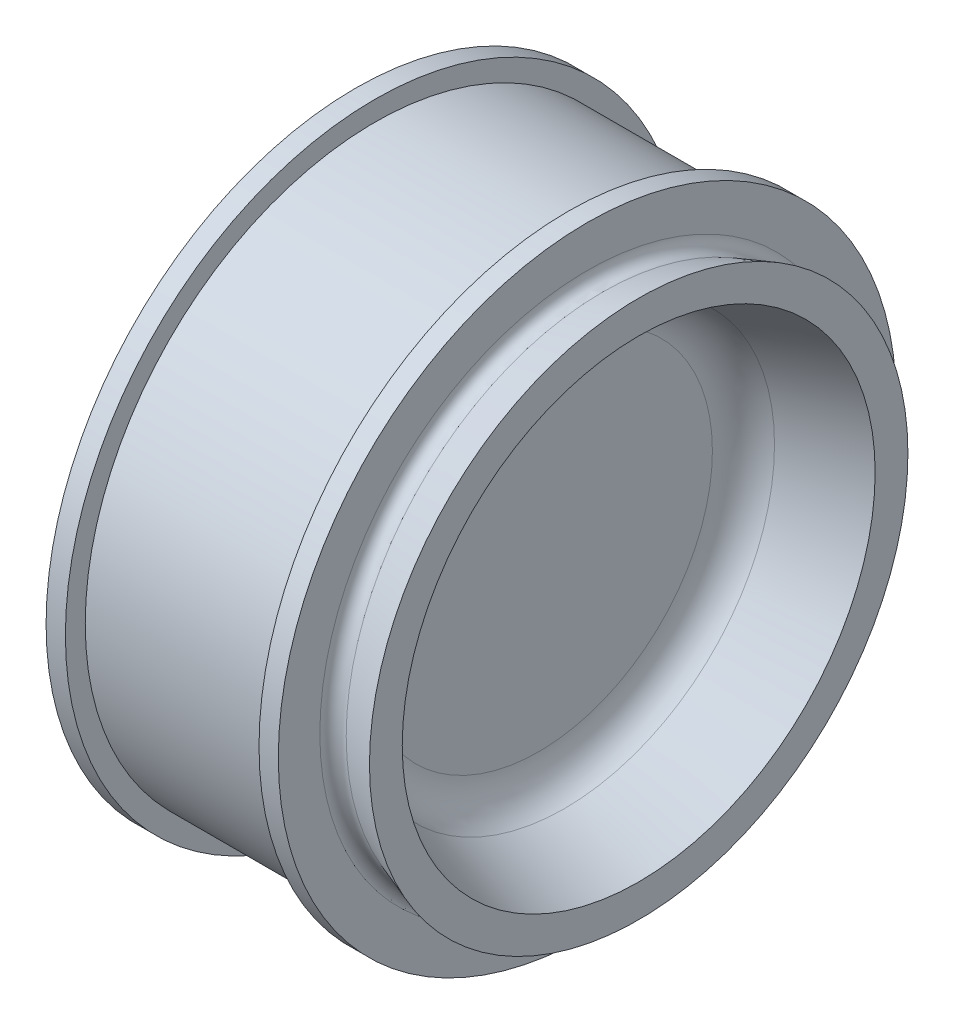
ISO-10303-21;
HEADER;
FILE_DESCRIPTION(('STEP AP214'),'2;1');
FILE_NAME('part.step','',(''),(''),'','','');
FILE_SCHEMA(('AUTOMOTIVE_DESIGN { 1 0 10303 214 1 1 1 1 }'));
ENDSEC;
DATA;
#1=APPLICATION_CONTEXT('core data for automotive mechanical design processes');
#2=APPLICATION_PROTOCOL_DEFINITION('international standard','automotive_design',2000,#1);
#3=PRODUCT_CONTEXT('',#1,'mechanical');
#4=PRODUCT('Part','Part','',(#3));
#5=PRODUCT_RELATED_PRODUCT_CATEGORY('part','',(#4));
#6=PRODUCT_DEFINITION_FORMATION('','',#4);
#7=PRODUCT_DEFINITION_CONTEXT('part definition',#1,'design');
#8=PRODUCT_DEFINITION('design','',#6,#7);
#9=PRODUCT_DEFINITION_SHAPE('','',#8);
#10=(LENGTH_UNIT() NAMED_UNIT(*) SI_UNIT(.MILLI.,.METRE.));
#11=(NAMED_UNIT(*) PLANE_ANGLE_UNIT() SI_UNIT($,.RADIAN.));
#12=(NAMED_UNIT(*) SI_UNIT($,.STERADIAN.) SOLID_ANGLE_UNIT());
#13=UNCERTAINTY_MEASURE_WITH_UNIT(LENGTH_MEASURE(1.E-05),#10,'distance_accuracy_value','');
#14=(GEOMETRIC_REPRESENTATION_CONTEXT(3) GLOBAL_UNCERTAINTY_ASSIGNED_CONTEXT((#13)) GLOBAL_UNIT_ASSIGNED_CONTEXT((#10,
#11,#12)) REPRESENTATION_CONTEXT('',''));
#15=CARTESIAN_POINT('',(0.,0.,0.));
#16=DIRECTION('',(0.,0.,1.));
#17=DIRECTION('',(1.,0.,0.));
#18=AXIS2_PLACEMENT_3D('',#15,#16,#17);
#19=CARTESIAN_POINT('',(0.,59.226522002156,0.));
#20=DIRECTION('',(1.,0.,0.));
#21=DIRECTION('',(0.,0.,-1.));
#22=AXIS2_PLACEMENT_3D('',#19,#20,#21);
#23=PLANE('',#22);
#24=DIRECTION('',(0.,0.,1.));
#25=VECTOR('',#24,1.);
#26=CARTESIAN_POINT('',(0.,15.0563883744709,0.));
#27=LINE('',#26,#25);
#28=CARTESIAN_POINT('',(0.,15.0563883744709,11.));
#29=VERTEX_POINT('',#28);
#30=CARTESIAN_POINT('',(0.,15.0563883744709,53.4031665524604));
#31=VERTEX_POINT('',#30);
#32=EDGE_CURVE('E328',#29,#31,#27,.T.);
#33=ORIENTED_EDGE('',*,*,#32,.T.);
#34=CARTESIAN_POINT('',(0.,4.8583493472853,0.));
#35=DIRECTION('',(-1.,0.,0.));
#36=DIRECTION('',(0.,0.,1.));
#37=AXIS2_PLACEMENT_3D('',#34,#35,#36);
#38=CIRCLE('',#37,54.3681726548707);
#39=CARTESIAN_POINT('',(0.,15.0563883744709,-53.4031665524604));
#40=VERTEX_POINT('',#39);
#41=EDGE_CURVE('E383',#31,#40,#38,.T.);
#42=ORIENTED_EDGE('',*,*,#41,.T.);
#43=DIRECTION('',(0.,0.,-1.));
#44=VECTOR('',#43,1.);
#45=CARTESIAN_POINT('',(0.,15.0563883744709,0.));
#46=LINE('',#45,#44);
#47=CARTESIAN_POINT('',(0.,15.0563883744709,-11.));
#48=VERTEX_POINT('',#47);
#49=EDGE_CURVE('E351',#48,#40,#46,.T.);
#50=ORIENTED_EDGE('',*,*,#49,.F.);
#51=CARTESIAN_POINT('',(0.,4.8583493472853,0.));
#52=DIRECTION('',(1.,0.,0.));
#53=DIRECTION('',(0.,0.,-1.));
#54=AXIS2_PLACEMENT_3D('',#51,#52,#53);
#55=CIRCLE('',#54,15.);
#56=EDGE_CURVE('E495',#48,#29,#55,.T.);
#57=ORIENTED_EDGE('',*,*,#56,.T.);
#58=EDGE_LOOP('',(#33,#42,#50,#57));
#59=FACE_BOUND('',#58,.T.);
#60=ADVANCED_FACE('F96',(#59),#23,.F.);
#61=CARTESIAN_POINT('',(-56.5990137935586,4.8583493472853,0.));
#62=DIRECTION('',(-1.,0.,0.));
#63=DIRECTION('',(0.,0.,1.));
#64=AXIS2_PLACEMENT_3D('',#61,#62,#63);
#65=CYLINDRICAL_SURFACE('',#64,15.);
#66=DIRECTION('',(-1.,0.,0.));
#67=VECTOR('',#66,1.);
#68=CARTESIAN_POINT('',(0.,15.0563883744709,11.));
#69=LINE('',#68,#67);
#70=CARTESIAN_POINT('',(-30.,15.0563883744709,11.));
#71=VERTEX_POINT('',#70);
#72=EDGE_CURVE('E340',#29,#71,#69,.T.);
#73=ORIENTED_EDGE('',*,*,#72,.F.);
#74=ORIENTED_EDGE('',*,*,#56,.F.);
#75=DIRECTION('',(-1.,0.,0.));
#76=VECTOR('',#75,1.);
#77=CARTESIAN_POINT('',(0.,15.0563883744709,-11.));
#78=LINE('',#77,#76);
#79=CARTESIAN_POINT('',(-30.,15.0563883744709,-11.));
#80=VERTEX_POINT('',#79);
#81=EDGE_CURVE('E366',#48,#80,#78,.T.);
#82=ORIENTED_EDGE('',*,*,#81,.T.);
#83=CARTESIAN_POINT('',(-30.,4.85834934728529,0.));
#84=DIRECTION('',(1.,0.,0.));
#85=DIRECTION('',(0.,0.,-1.));
#86=AXIS2_PLACEMENT_3D('',#83,#84,#85);
#87=CIRCLE('',#86,15.);
#88=EDGE_CURVE('E470',#80,#71,#87,.T.);
#89=ORIENTED_EDGE('',*,*,#88,.T.);
#90=EDGE_LOOP('',(#73,#74,#82,#89));
#91=FACE_BOUND('',#90,.T.);
#92=ADVANCED_FACE('F524',(#91),#65,.T.);
#93=CARTESIAN_POINT('',(22.5,69.8583493472853,0.));
#94=DIRECTION('',(1.,0.,0.));
#95=DIRECTION('',(0.,0.,-1.));
#96=AXIS2_PLACEMENT_3D('',#93,#94,#95);
#97=PLANE('',#96);
#98=CARTESIAN_POINT('',(22.5,4.8583493472853,0.));
#99=DIRECTION('',(1.,0.,0.));
#100=DIRECTION('',(0.,0.,-1.));
#101=AXIS2_PLACEMENT_3D('',#98,#99,#100);
#102=CIRCLE('',#101,62.3420431637177);
#103=CARTESIAN_POINT('',(22.5,4.8583493472853,-62.3420431637177));
#104=VERTEX_POINT('',#103);
#105=EDGE_CURVE('E389',#104,#104,#102,.F.);
#106=ORIENTED_EDGE('',*,*,#105,.F.);
#107=EDGE_LOOP('',(#106));
#108=FACE_BOUND('',#107,.T.);
#109=CARTESIAN_POINT('',(22.5,4.8583493472853,0.));
#110=DIRECTION('',(-1.,0.,0.));
#111=DIRECTION('',(0.,0.,1.));
#112=AXIS2_PLACEMENT_3D('',#109,#110,#111);
#113=CIRCLE('',#112,65.);
#114=CARTESIAN_POINT('',(22.5,4.8583493472853,65.));
#115=VERTEX_POINT('',#114);
#116=EDGE_CURVE('E393',#115,#115,#113,.T.);
#117=ORIENTED_EDGE('',*,*,#116,.T.);
#118=EDGE_LOOP('',(#117));
#119=FACE_BOUND('',#118,.T.);
#120=ADVANCED_FACE('F531',(#108,#119),#97,.F.);
#121=CARTESIAN_POINT('',(-56.5990137935586,4.8583493472853,0.));
#122=DIRECTION('',(-1.,0.,0.));
#123=DIRECTION('',(0.,0.,1.));
#124=AXIS2_PLACEMENT_3D('',#121,#122,#123);
#125=CYLINDRICAL_SURFACE('',#124,65.);
#126=ORIENTED_EDGE('',*,*,#116,.F.);
#127=EDGE_LOOP('',(#126));
#128=FACE_BOUND('',#127,.T.);
#129=CARTESIAN_POINT('',(-30.,4.8583493472853,0.));
#130=DIRECTION('',(-1.,0.,0.));
#131=DIRECTION('',(0.,0.,1.));
#132=AXIS2_PLACEMENT_3D('',#129,#130,#131);
#133=CIRCLE('',#132,65.);
#134=CARTESIAN_POINT('',(-30.,-5.33968967990028,-64.1950153828161));
#135=VERTEX_POINT('',#134);
#136=CARTESIAN_POINT('',(-30.,-5.33968967990028,64.1950153828161));
#137=VERTEX_POINT('',#136);
#138=EDGE_CURVE('E491',#135,#137,#133,.T.);
#139=ORIENTED_EDGE('',*,*,#138,.T.);
#140=DIRECTION('',(-1.,0.,0.));
#141=VECTOR('',#140,1.);
#142=CARTESIAN_POINT('',(0.,-5.33968967990028,64.1950153828161));
#143=LINE('',#142,#141);
#144=CARTESIAN_POINT('',(0.,-5.33968967990028,64.1950153828161));
#145=VERTEX_POINT('',#144);
#146=EDGE_CURVE('E330',#145,#137,#143,.T.);
#147=ORIENTED_EDGE('',*,*,#146,.F.);
#148=CARTESIAN_POINT('',(0.,4.8583493472853,0.));
#149=DIRECTION('',(-1.,0.,0.));
#150=DIRECTION('',(0.,0.,1.));
#151=AXIS2_PLACEMENT_3D('',#148,#149,#150);
#152=CIRCLE('',#151,65.);
#153=CARTESIAN_POINT('',(0.,15.0563883744709,64.1950153828161));
#154=VERTEX_POINT('',#153);
#155=EDGE_CURVE('E324',#145,#154,#152,.T.);
#156=ORIENTED_EDGE('',*,*,#155,.T.);
#157=DIRECTION('',(-1.,0.,0.));
#158=VECTOR('',#157,1.);
#159=CARTESIAN_POINT('',(0.,15.0563883744709,64.1950153828161));
#160=LINE('',#159,#158);
#161=CARTESIAN_POINT('',(-30.,15.0563883744709,64.1950153828161));
#162=VERTEX_POINT('',#161);
#163=EDGE_CURVE('E343',#154,#162,#160,.T.);
#164=ORIENTED_EDGE('',*,*,#163,.T.);
#165=CARTESIAN_POINT('',(-30.,15.0563883744709,-64.1950153828161));
#166=VERTEX_POINT('',#165);
#167=EDGE_CURVE('E490',#162,#166,#133,.T.);
#168=ORIENTED_EDGE('',*,*,#167,.T.);
#169=DIRECTION('',(-1.,0.,0.));
#170=VECTOR('',#169,1.);
#171=CARTESIAN_POINT('',(0.,15.0563883744709,-64.1950153828161));
#172=LINE('',#171,#170);
#173=CARTESIAN_POINT('',(0.,15.0563883744709,-64.1950153828161));
#174=VERTEX_POINT('',#173);
#175=EDGE_CURVE('E360',#174,#166,#172,.T.);
#176=ORIENTED_EDGE('',*,*,#175,.F.);
#177=CARTESIAN_POINT('',(0.,4.8583493472853,0.));
#178=DIRECTION('',(-1.,0.,0.));
#179=DIRECTION('',(0.,0.,1.));
#180=AXIS2_PLACEMENT_3D('',#177,#178,#179);
#181=CIRCLE('',#180,65.);
#182=CARTESIAN_POINT('',(0.,-5.33968967990028,-64.1950153828161));
#183=VERTEX_POINT('',#182);
#184=EDGE_CURVE('E354',#174,#183,#181,.T.);
#185=ORIENTED_EDGE('',*,*,#184,.T.);
#186=DIRECTION('',(-1.,0.,0.));
#187=VECTOR('',#186,1.);
#188=CARTESIAN_POINT('',(0.,-5.33968967990028,-64.1950153828161));
#189=LINE('',#188,#187);
#190=EDGE_CURVE('E373',#183,#135,#189,.T.);
#191=ORIENTED_EDGE('',*,*,#190,.T.);
#192=EDGE_LOOP('',(#139,#147,#156,#164,#168,#176,#185,#191));
#193=FACE_BOUND('',#192,.T.);
#194=ADVANCED_FACE('F586',(#128,#193),#125,.F.);
#195=CARTESIAN_POINT('',(-30.,69.8583493472853,0.));
#196=DIRECTION('',(1.,0.,0.));
#197=DIRECTION('',(0.,0.,-1.));
#198=AXIS2_PLACEMENT_3D('',#195,#196,#197);
#199=PLANE('',#198);
#200=ORIENTED_EDGE('',*,*,#167,.F.);
#201=DIRECTION('',(0.,0.,1.));
#202=VECTOR('',#201,1.);
#203=CARTESIAN_POINT('',(-30.,15.0563883744709,0.));
#204=LINE('',#203,#202);
#205=EDGE_CURVE('E333',#71,#162,#204,.T.);
#206=ORIENTED_EDGE('',*,*,#205,.F.);
#207=ORIENTED_EDGE('',*,*,#88,.F.);
#208=DIRECTION('',(0.,0.,-1.));
#209=VECTOR('',#208,1.);
#210=CARTESIAN_POINT('',(-30.,15.0563883744709,0.));
#211=LINE('',#210,#209);
#212=EDGE_CURVE('E350',#80,#166,#211,.T.);
#213=ORIENTED_EDGE('',*,*,#212,.T.);
#214=EDGE_LOOP('',(#200,#206,#207,#213));
#215=FACE_BOUND('',#214,.T.);
#216=ORIENTED_EDGE('',*,*,#138,.F.);
#217=DIRECTION('',(0.,0.,-1.));
#218=VECTOR('',#217,1.);
#219=CARTESIAN_POINT('',(-30.,-5.33968967990028,0.));
#220=LINE('',#219,#218);
#221=CARTESIAN_POINT('',(-30.,-5.33968967990028,-11.));
#222=VERTEX_POINT('',#221);
#223=EDGE_CURVE('E363',#222,#135,#220,.T.);
#224=ORIENTED_EDGE('',*,*,#223,.F.);
#225=CARTESIAN_POINT('',(-30.,-5.33968967990028,11.));
#226=VERTEX_POINT('',#225);
#227=EDGE_CURVE('E436',#226,#222,#87,.T.);
#228=ORIENTED_EDGE('',*,*,#227,.F.);
#229=DIRECTION('',(0.,0.,1.));
#230=VECTOR('',#229,1.);
#231=CARTESIAN_POINT('',(-30.,-5.33968967990028,0.));
#232=LINE('',#231,#230);
#233=EDGE_CURVE('E320',#226,#137,#232,.T.);
#234=ORIENTED_EDGE('',*,*,#233,.T.);
#235=EDGE_LOOP('',(#216,#224,#228,#234));
#236=FACE_BOUND('',#235,.T.);
#237=CARTESIAN_POINT('',(-30.,4.8583493472853,0.));
#238=DIRECTION('',(-1.,0.,0.));
#239=DIRECTION('',(0.,0.,1.));
#240=AXIS2_PLACEMENT_3D('',#237,#238,#239);
#241=CIRCLE('',#240,80.1416506527147);
#242=CARTESIAN_POINT('',(-30.,4.8583493472853,80.1416506527147));
#243=VERTEX_POINT('',#242);
#244=EDGE_CURVE('E487',#243,#243,#241,.T.);
#245=ORIENTED_EDGE('',*,*,#244,.T.);
#246=EDGE_LOOP('',(#245));
#247=FACE_BOUND('',#246,.T.);
#248=DIRECTION('',(0.,1.,0.));
#249=VECTOR('',#248,1.);
#250=CARTESIAN_POINT('',(-30.,7.8163892388351,0.5));
#251=LINE('',#250,#249);
#252=CARTESIAN_POINT('',(-30.,7.8163892388351,0.5));
#253=VERTEX_POINT('',#252);
#254=CARTESIAN_POINT('',(-30.,9.35834934728529,0.5));
#255=VERTEX_POINT('',#254);
#256=EDGE_CURVE('E430',#253,#255,#251,.T.);
#257=ORIENTED_EDGE('',*,*,#256,.F.);
#258=CARTESIAN_POINT('',(-30.,4.8583493472853,0.));
#259=DIRECTION('',(1.,0.,0.));
#260=DIRECTION('',(0.,0.,-1.));
#261=AXIS2_PLACEMENT_3D('',#258,#259,#260);
#262=CIRCLE('',#261,3.);
#263=CARTESIAN_POINT('',(-30.,5.3583493472853,2.95803989154981));
#264=VERTEX_POINT('',#263);
#265=EDGE_CURVE('E387',#253,#264,#262,.T.);
#266=ORIENTED_EDGE('',*,*,#265,.T.);
#267=DIRECTION('',(0.,0.,1.));
#268=VECTOR('',#267,1.);
#269=CARTESIAN_POINT('',(-30.,5.3583493472853,2.95803989154981));
#270=LINE('',#269,#268);
#271=CARTESIAN_POINT('',(-30.,5.3583493472853,4.5));
#272=VERTEX_POINT('',#271);
#273=EDGE_CURVE('E396',#264,#272,#270,.T.);
#274=ORIENTED_EDGE('',*,*,#273,.T.);
#275=DIRECTION('',(0.,-1.,0.));
#276=VECTOR('',#275,1.);
#277=CARTESIAN_POINT('',(-30.,5.3583493472853,4.5));
#278=LINE('',#277,#276);
#279=CARTESIAN_POINT('',(-30.,4.3583493472853,4.5));
#280=VERTEX_POINT('',#279);
#281=EDGE_CURVE('E399',#272,#280,#278,.T.);
#282=ORIENTED_EDGE('',*,*,#281,.T.);
#283=DIRECTION('',(0.,0.,-1.));
#284=VECTOR('',#283,1.);
#285=CARTESIAN_POINT('',(-30.,4.3583493472853,4.5));
#286=LINE('',#285,#284);
#287=CARTESIAN_POINT('',(-30.,4.3583493472853,2.95803989154981));
#288=VERTEX_POINT('',#287);
#289=EDGE_CURVE('E402',#280,#288,#286,.T.);
#290=ORIENTED_EDGE('',*,*,#289,.T.);
#291=CARTESIAN_POINT('',(-30.,4.8583493472853,0.));
#292=DIRECTION('',(1.,0.,0.));
#293=DIRECTION('',(0.,0.,-1.));
#294=AXIS2_PLACEMENT_3D('',#291,#292,#293);
#295=CIRCLE('',#294,3.);
#296=CARTESIAN_POINT('',(-30.,1.90030945573549,0.500000000000002));
#297=VERTEX_POINT('',#296);
#298=EDGE_CURVE('E405',#288,#297,#295,.T.);
#299=ORIENTED_EDGE('',*,*,#298,.T.);
#300=DIRECTION('',(0.,-1.,0.));
#301=VECTOR('',#300,1.);
#302=CARTESIAN_POINT('',(-30.,1.90030945573549,0.5));
#303=LINE('',#302,#301);
#304=CARTESIAN_POINT('',(-30.,0.358349347285294,0.5));
#305=VERTEX_POINT('',#304);
#306=EDGE_CURVE('E408',#297,#305,#303,.T.);
#307=ORIENTED_EDGE('',*,*,#306,.T.);
#308=DIRECTION('',(0.,0.,1.));
#309=VECTOR('',#308,1.);
#310=CARTESIAN_POINT('',(-30.,0.358349347285294,-0.5));
#311=LINE('',#310,#309);
#312=CARTESIAN_POINT('',(-30.,0.358349347285294,-0.5));
#313=VERTEX_POINT('',#312);
#314=EDGE_CURVE('E411',#313,#305,#311,.T.);
#315=ORIENTED_EDGE('',*,*,#314,.F.);
#316=DIRECTION('',(0.,-1.,0.));
#317=VECTOR('',#316,1.);
#318=CARTESIAN_POINT('',(-30.,1.90030945573549,-0.5));
#319=LINE('',#318,#317);
#320=CARTESIAN_POINT('',(-30.,1.90030945573549,-0.5));
#321=VERTEX_POINT('',#320);
#322=EDGE_CURVE('E413',#321,#313,#319,.T.);
#323=ORIENTED_EDGE('',*,*,#322,.F.);
#324=CARTESIAN_POINT('',(-30.,4.8583493472853,0.));
#325=DIRECTION('',(1.,0.,0.));
#326=DIRECTION('',(0.,0.,-1.));
#327=AXIS2_PLACEMENT_3D('',#324,#325,#326);
#328=CIRCLE('',#327,3.);
#329=CARTESIAN_POINT('',(-30.,4.3583493472853,-2.95803989154981));
#330=VERTEX_POINT('',#329);
#331=EDGE_CURVE('E415',#321,#330,#328,.T.);
#332=ORIENTED_EDGE('',*,*,#331,.T.);
#333=DIRECTION('',(0.,0.,1.));
#334=VECTOR('',#333,1.);
#335=CARTESIAN_POINT('',(-30.,4.3583493472853,-4.5));
#336=LINE('',#335,#334);
#337=CARTESIAN_POINT('',(-30.,4.3583493472853,-4.5));
#338=VERTEX_POINT('',#337);
#339=EDGE_CURVE('E289',#338,#330,#336,.T.);
#340=ORIENTED_EDGE('',*,*,#339,.F.);
#341=DIRECTION('',(0.,-1.,0.));
#342=VECTOR('',#341,1.);
#343=CARTESIAN_POINT('',(-30.,5.35834934728529,-4.5));
#344=LINE('',#343,#342);
#345=CARTESIAN_POINT('',(-30.,5.35834934728529,-4.5));
#346=VERTEX_POINT('',#345);
#347=EDGE_CURVE('E418',#346,#338,#344,.T.);
#348=ORIENTED_EDGE('',*,*,#347,.F.);
#349=DIRECTION('',(0.,0.,-1.));
#350=VECTOR('',#349,1.);
#351=CARTESIAN_POINT('',(-30.,5.35834934728529,-2.95803989154981));
#352=LINE('',#351,#350);
#353=CARTESIAN_POINT('',(-30.,5.35834934728529,-2.95803989154981));
#354=VERTEX_POINT('',#353);
#355=EDGE_CURVE('E420',#354,#346,#352,.T.);
#356=ORIENTED_EDGE('',*,*,#355,.F.);
#357=CARTESIAN_POINT('',(-30.,4.85834934728529,0.));
#358=DIRECTION('',(1.,0.,0.));
#359=DIRECTION('',(0.,0.,-1.));
#360=AXIS2_PLACEMENT_3D('',#357,#358,#359);
#361=CIRCLE('',#360,3.);
#362=CARTESIAN_POINT('',(-30.,7.8168030903994,-0.497545424915299));
#363=VERTEX_POINT('',#362);
#364=EDGE_CURVE('E422',#354,#363,#361,.T.);
#365=ORIENTED_EDGE('',*,*,#364,.T.);
#366=DIRECTION('',(0.,-1.,0.));
#367=VECTOR('',#366,1.);
#368=CARTESIAN_POINT('',(-30.,9.35834934728529,-0.497545424915299));
#369=LINE('',#368,#367);
#370=CARTESIAN_POINT('',(-30.,9.35834934728529,-0.497545424915299));
#371=VERTEX_POINT('',#370);
#372=EDGE_CURVE('E425',#371,#363,#369,.T.);
#373=ORIENTED_EDGE('',*,*,#372,.F.);
#374=DIRECTION('',(0.,0.,1.));
#375=VECTOR('',#374,1.);
#376=CARTESIAN_POINT('',(-30.,9.35834934728529,-0.497545424915299));
#377=LINE('',#376,#375);
#378=EDGE_CURVE('E427',#371,#255,#377,.T.);
#379=ORIENTED_EDGE('',*,*,#378,.T.);
#380=EDGE_LOOP('',(#257,#266,#274,#282,#290,#299,#307,#315,#323,#332,#340,#348,#356,#365,#373,#379));
#381=FACE_BOUND('',#380,.T.);
#382=ADVANCED_FACE('F588',(#215,#236,#247,#381),#199,.F.);
#383=CARTESIAN_POINT('',(-56.5990137935586,4.8583493472853,0.));
#384=DIRECTION('',(-1.,0.,0.));
#385=DIRECTION('',(0.,0.,1.));
#386=AXIS2_PLACEMENT_3D('',#383,#384,#385);
#387=CYLINDRICAL_SURFACE('',#386,80.1416506527147);
#388=ORIENTED_EDGE('',*,*,#244,.F.);
#389=EDGE_LOOP('',(#388));
#390=FACE_BOUND('',#389,.T.);
#391=CARTESIAN_POINT('',(-25.,4.8583493472853,0.));
#392=DIRECTION('',(-1.,0.,0.));
#393=DIRECTION('',(0.,0.,1.));
#394=AXIS2_PLACEMENT_3D('',#391,#392,#393);
#395=CIRCLE('',#394,80.1416506527147);
#396=CARTESIAN_POINT('',(-25.,4.8583493472853,80.1416506527147));
#397=VERTEX_POINT('',#396);
#398=EDGE_CURVE('E484',#397,#397,#395,.T.);
#399=ORIENTED_EDGE('',*,*,#398,.T.);
#400=EDGE_LOOP('',(#399));
#401=FACE_BOUND('',#400,.T.);
#402=ADVANCED_FACE('F595',(#390,#401),#387,.T.);
#403=CARTESIAN_POINT('',(-25.,85.,0.));
#404=DIRECTION('',(-1.,0.,0.));
#405=DIRECTION('',(0.,0.,1.));
#406=AXIS2_PLACEMENT_3D('',#403,#404,#405);
#407=PLANE('',#406);
#408=ORIENTED_EDGE('',*,*,#398,.F.);
#409=EDGE_LOOP('',(#408));
#410=FACE_BOUND('',#409,.T.);
#411=CARTESIAN_POINT('',(-25.,4.8583493472853,0.));
#412=DIRECTION('',(-1.,0.,0.));
#413=DIRECTION('',(0.,0.,1.));
#414=AXIS2_PLACEMENT_3D('',#411,#412,#413);
#415=CIRCLE('',#414,75.);
#416=CARTESIAN_POINT('',(-25.,4.8583493472853,75.));
#417=VERTEX_POINT('',#416);
#418=EDGE_CURVE('E481',#417,#417,#415,.T.);
#419=ORIENTED_EDGE('',*,*,#418,.T.);
#420=EDGE_LOOP('',(#419));
#421=FACE_BOUND('',#420,.T.);
#422=ADVANCED_FACE('F601',(#410,#421),#407,.F.);
#423=CARTESIAN_POINT('',(-56.5990137935586,4.8583493472853,0.));
#424=DIRECTION('',(-1.,0.,0.));
#425=DIRECTION('',(0.,0.,1.));
#426=AXIS2_PLACEMENT_3D('',#423,#424,#425);
#427=CYLINDRICAL_SURFACE('',#426,75.);
#428=ORIENTED_EDGE('',*,*,#418,.F.);
#429=EDGE_LOOP('',(#428));
#430=FACE_BOUND('',#429,.T.);
#431=CARTESIAN_POINT('',(25.,4.8583493472853,0.));
#432=DIRECTION('',(-1.,0.,0.));
#433=DIRECTION('',(0.,0.,1.));
#434=AXIS2_PLACEMENT_3D('',#431,#432,#433);
#435=CIRCLE('',#434,75.);
#436=CARTESIAN_POINT('',(25.,4.8583493472853,75.));
#437=VERTEX_POINT('',#436);
#438=EDGE_CURVE('E478',#437,#437,#435,.T.);
#439=ORIENTED_EDGE('',*,*,#438,.T.);
#440=EDGE_LOOP('',(#439));
#441=FACE_BOUND('',#440,.T.);
#442=ADVANCED_FACE('F687',(#430,#441),#427,.T.);
#443=CARTESIAN_POINT('',(25.,84.8583493472853,0.));
#444=DIRECTION('',(1.,0.,0.));
#445=DIRECTION('',(0.,0.,-1.));
#446=AXIS2_PLACEMENT_3D('',#443,#444,#445);
#447=PLANE('',#446);
#448=ORIENTED_EDGE('',*,*,#438,.F.);
#449=EDGE_LOOP('',(#448));
#450=FACE_BOUND('',#449,.T.);
#451=CARTESIAN_POINT('',(25.,4.8583493472853,0.));
#452=DIRECTION('',(-1.,0.,0.));
#453=DIRECTION('',(0.,0.,1.));
#454=AXIS2_PLACEMENT_3D('',#451,#452,#453);
#455=CIRCLE('',#454,80.);
#456=CARTESIAN_POINT('',(25.,4.8583493472853,80.));
#457=VERTEX_POINT('',#456);
#458=EDGE_CURVE('E475',#457,#457,#455,.T.);
#459=ORIENTED_EDGE('',*,*,#458,.T.);
#460=EDGE_LOOP('',(#459));
#461=FACE_BOUND('',#460,.T.);
#462=ADVANCED_FACE('F683',(#450,#461),#447,.F.);
#463=CARTESIAN_POINT('',(-56.5990137935586,4.8583493472853,0.));
#464=DIRECTION('',(-1.,0.,0.));
#465=DIRECTION('',(0.,0.,1.));
#466=AXIS2_PLACEMENT_3D('',#463,#464,#465);
#467=CYLINDRICAL_SURFACE('',#466,80.);
#468=ORIENTED_EDGE('',*,*,#458,.F.);
#469=EDGE_LOOP('',(#468));
#470=FACE_BOUND('',#469,.T.);
#471=CARTESIAN_POINT('',(30.,4.8583493472853,0.));
#472=DIRECTION('',(-1.,0.,0.));
#473=DIRECTION('',(0.,0.,1.));
#474=AXIS2_PLACEMENT_3D('',#471,#472,#473);
#475=CIRCLE('',#474,80.);
#476=CARTESIAN_POINT('',(30.,4.8583493472853,80.));
#477=VERTEX_POINT('',#476);
#478=EDGE_CURVE('E472',#477,#477,#475,.T.);
#479=ORIENTED_EDGE('',*,*,#478,.T.);
#480=EDGE_LOOP('',(#479));
#481=FACE_BOUND('',#480,.T.);
#482=ADVANCED_FACE('F679',(#470,#481),#467,.T.);
#483=CARTESIAN_POINT('',(30.,69.8583493472853,0.));
#484=DIRECTION('',(-1.,0.,0.));
#485=DIRECTION('',(0.,0.,1.));
#486=AXIS2_PLACEMENT_3D('',#483,#484,#485);
#487=PLANE('',#486);
#488=CARTESIAN_POINT('',(30.,4.8583493472853,0.));
#489=DIRECTION('',(-1.,0.,0.));
#490=DIRECTION('',(0.,0.,1.));
#491=AXIS2_PLACEMENT_3D('',#488,#489,#490);
#492=CIRCLE('',#491,69.2460049926616);
#493=CARTESIAN_POINT('',(30.,4.8583493472853,69.2460049926616));
#494=VERTEX_POINT('',#493);
#495=EDGE_CURVE('E12',#494,#494,#492,.T.);
#496=ORIENTED_EDGE('',*,*,#495,.T.);
#497=EDGE_LOOP('',(#496));
#498=FACE_BOUND('',#497,.T.);
#499=ORIENTED_EDGE('',*,*,#478,.F.);
#500=EDGE_LOOP('',(#499));
#501=FACE_BOUND('',#500,.T.);
#502=ADVANCED_FACE('F675',(#498,#501),#487,.F.);
#503=CARTESIAN_POINT('',(43.3289926404928,74.5820676285593,0.));
#504=DIRECTION('',(-1.,0.,0.));
#505=DIRECTION('',(0.,0.,1.));
#506=AXIS2_PLACEMENT_3D('',#503,#504,#505);
#507=PLANE('',#506);
#508=CARTESIAN_POINT('',(43.3289926404928,4.8583493472853,0.));
#509=DIRECTION('',(-1.,0.,0.));
#510=DIRECTION('',(0.,0.,1.));
#511=AXIS2_PLACEMENT_3D('',#508,#509,#510);
#512=CIRCLE('',#511,61.2361922595443);
#513=CARTESIAN_POINT('',(43.3289926404928,4.8583493472853,61.2361922595443));
#514=VERTEX_POINT('',#513);
#515=EDGE_CURVE('E369',#514,#514,#512,.T.);
#516=ORIENTED_EDGE('',*,*,#515,.T.);
#517=EDGE_LOOP('',(#516));
#518=FACE_BOUND('',#517,.T.);
#519=CARTESIAN_POINT('',(43.3289926404928,4.8583493472853,0.));
#520=DIRECTION('',(-1.,0.,0.));
#521=DIRECTION('',(0.,0.,1.));
#522=AXIS2_PLACEMENT_3D('',#519,#520,#521);
#523=CIRCLE('',#522,69.723718281274);
#524=CARTESIAN_POINT('',(43.3289926404928,4.8583493472853,69.723718281274));
#525=VERTEX_POINT('',#524);
#526=EDGE_CURVE('E380',#525,#525,#523,.T.);
#527=ORIENTED_EDGE('',*,*,#526,.F.);
#528=EDGE_LOOP('',(#527));
#529=FACE_BOUND('',#528,.T.);
#530=ADVANCED_FACE('F678',(#518,#529),#507,.F.);
#531=CARTESIAN_POINT('',(43.3289926404928,4.8583493472853,0.));
#532=DIRECTION('',(1.,0.,0.));
#533=DIRECTION('',(0.,0.,-1.));
#534=AXIS2_PLACEMENT_3D('',#531,#532,#533);
#535=CONICAL_SURFACE('',#534,69.723718281274,0.340584137851173);
#536=CARTESIAN_POINT('',(34.0021132016948,4.8583493472853,0.));
#537=DIRECTION('',(1.,0.,0.));
#538=DIRECTION('',(0.,0.,-1.));
#539=AXIS2_PLACEMENT_3D('',#536,#537,#538);
#540=CIRCLE('',#539,66.4183258858694);
#541=CARTESIAN_POINT('',(34.0021132016948,4.8583493472853,-66.4183258858694));
#542=VERTEX_POINT('',#541);
#543=EDGE_CURVE('E104',#542,#542,#540,.T.);
#544=ORIENTED_EDGE('',*,*,#543,.T.);
#545=EDGE_LOOP('',(#544));
#546=FACE_BOUND('',#545,.T.);
#547=ORIENTED_EDGE('',*,*,#526,.T.);
#548=EDGE_LOOP('',(#547));
#549=FACE_BOUND('',#548,.T.);
#550=ADVANCED_FACE('F506',(#546,#549),#535,.T.);
#551=CARTESIAN_POINT('',(0.,-5.33968967990027,-53.4031665524604));
#552=VERTEX_POINT('',#551);
#553=EDGE_CURVE('E384',#40,#552,#38,.T.);
#554=ORIENTED_EDGE('',*,*,#553,.F.);
#555=ORIENTED_EDGE('',*,*,#41,.F.);
#556=CARTESIAN_POINT('',(0.,4.8583493472853,0.));
#557=DIRECTION('',(-1.,0.,0.));
#558=DIRECTION('',(0.,0.,1.));
#559=AXIS2_PLACEMENT_3D('',#556,#557,#558);
#560=CIRCLE('',#559,54.3681726548707);
#561=CARTESIAN_POINT('',(0.,-5.33968967990027,53.4031665524604));
#562=VERTEX_POINT('',#561);
#563=EDGE_CURVE('E339',#562,#31,#560,.T.);
#564=ORIENTED_EDGE('',*,*,#563,.F.);
#565=EDGE_CURVE('E388',#552,#562,#38,.T.);
#566=ORIENTED_EDGE('',*,*,#565,.F.);
#567=EDGE_LOOP('',(#554,#555,#564,#566));
#568=FACE_BOUND('',#567,.T.);
#569=ORIENTED_EDGE('',*,*,#105,.T.);
#570=EDGE_LOOP('',(#569));
#571=FACE_BOUND('',#570,.T.);
#572=ADVANCED_FACE('F539',(#568,#571),#535,.T.);
#573=ORIENTED_EDGE('',*,*,#565,.T.);
#574=DIRECTION('',(0.,0.,1.));
#575=VECTOR('',#574,1.);
#576=CARTESIAN_POINT('',(0.,-5.33968967990028,0.));
#577=LINE('',#576,#575);
#578=CARTESIAN_POINT('',(0.,-5.33968967990028,11.));
#579=VERTEX_POINT('',#578);
#580=EDGE_CURVE('E321',#579,#562,#577,.T.);
#581=ORIENTED_EDGE('',*,*,#580,.F.);
#582=CARTESIAN_POINT('',(0.,-5.33968967990028,-11.));
#583=VERTEX_POINT('',#582);
#584=EDGE_CURVE('E392',#579,#583,#55,.T.);
#585=ORIENTED_EDGE('',*,*,#584,.T.);
#586=DIRECTION('',(0.,0.,-1.));
#587=VECTOR('',#586,1.);
#588=CARTESIAN_POINT('',(0.,-5.33968967990028,0.));
#589=LINE('',#588,#587);
#590=EDGE_CURVE('E358',#583,#552,#589,.T.);
#591=ORIENTED_EDGE('',*,*,#590,.T.);
#592=EDGE_LOOP('',(#573,#581,#585,#591));
#593=FACE_BOUND('',#592,.T.);
#594=ADVANCED_FACE('F527',(#593),#23,.F.);
#595=CARTESIAN_POINT('',(-30.,9.35834934728529,-0.497545424915299));
#596=DIRECTION('',(0.,1.,0.));
#597=DIRECTION('',(0.,0.,1.));
#598=AXIS2_PLACEMENT_3D('',#595,#596,#597);
#599=PLANE('',#598);
#600=DIRECTION('',(1.,0.,0.));
#601=VECTOR('',#600,1.);
#602=CARTESIAN_POINT('',(-30.,9.35834934728529,-0.497545424915299));
#603=LINE('',#602,#601);
#604=CARTESIAN_POINT('',(-21.9,9.35834934728529,-0.497545424915299));
#605=VERTEX_POINT('',#604);
#606=EDGE_CURVE('E439',#371,#605,#603,.T.);
#607=ORIENTED_EDGE('',*,*,#606,.T.);
#608=DIRECTION('',(0.,0.,-1.));
#609=VECTOR('',#608,1.);
#610=CARTESIAN_POINT('',(-21.9,9.35834934728529,0.));
#611=LINE('',#610,#609);
#612=CARTESIAN_POINT('',(-21.9,9.35834934728529,0.5));
#613=VERTEX_POINT('',#612);
#614=EDGE_CURVE('E315',#613,#605,#611,.T.);
#615=ORIENTED_EDGE('',*,*,#614,.F.);
#616=DIRECTION('',(1.,0.,0.));
#617=VECTOR('',#616,1.);
#618=CARTESIAN_POINT('',(-30.,9.35834934728529,0.5));
#619=LINE('',#618,#617);
#620=EDGE_CURVE('E437',#255,#613,#619,.T.);
#621=ORIENTED_EDGE('',*,*,#620,.F.);
#622=ORIENTED_EDGE('',*,*,#378,.F.);
#623=EDGE_LOOP('',(#607,#615,#621,#622));
#624=FACE_BOUND('',#623,.T.);
#625=ADVANCED_FACE('F538',(#624),#599,.F.);
#626=CARTESIAN_POINT('',(-30.,9.35834934728529,-0.497545424915299));
#627=DIRECTION('',(0.,0.,1.));
#628=DIRECTION('',(1.,0.,0.));
#629=AXIS2_PLACEMENT_3D('',#626,#627,#628);
#630=PLANE('',#629);
#631=DIRECTION('',(0.,-1.,0.));
#632=VECTOR('',#631,1.);
#633=CARTESIAN_POINT('',(-21.9,0.,-0.497545424915297));
#634=LINE('',#633,#632);
#635=CARTESIAN_POINT('',(-21.9,7.8168030903994,-0.4975454249153));
#636=VERTEX_POINT('',#635);
#637=EDGE_CURVE('E111',#605,#636,#634,.T.);
#638=ORIENTED_EDGE('',*,*,#637,.F.);
#639=ORIENTED_EDGE('',*,*,#606,.F.);
#640=ORIENTED_EDGE('',*,*,#372,.T.);
#641=DIRECTION('',(1.,0.,0.));
#642=VECTOR('',#641,1.);
#643=CARTESIAN_POINT('',(-30.,7.8168030903994,-0.497545424915299));
#644=LINE('',#643,#642);
#645=EDGE_CURVE('E441',#363,#636,#644,.T.);
#646=ORIENTED_EDGE('',*,*,#645,.T.);
#647=EDGE_LOOP('',(#638,#639,#640,#646));
#648=FACE_BOUND('',#647,.T.);
#649=ADVANCED_FACE('F546',(#648),#630,.T.);
#650=CARTESIAN_POINT('',(-30.,4.85834934728529,0.));
#651=DIRECTION('',(1.,0.,0.));
#652=DIRECTION('',(0.,0.,-1.));
#653=AXIS2_PLACEMENT_3D('',#650,#651,#652);
#654=CYLINDRICAL_SURFACE('',#653,3.);
#655=DIRECTION('',(1.,0.,0.));
#656=VECTOR('',#655,1.);
#657=CARTESIAN_POINT('',(-30.,5.35834934728529,-2.95803989154981));
#658=LINE('',#657,#656);
#659=CARTESIAN_POINT('',(-21.9,5.35834934728529,-2.95803989154981));
#660=VERTEX_POINT('',#659);
#661=EDGE_CURVE('E443',#354,#660,#658,.T.);
#662=ORIENTED_EDGE('',*,*,#661,.T.);
#663=CARTESIAN_POINT('',(-21.9,4.8583493472853,0.));
#664=DIRECTION('',(-1.,0.,0.));
#665=DIRECTION('',(0.,0.,1.));
#666=AXIS2_PLACEMENT_3D('',#663,#664,#665);
#667=CIRCLE('',#666,3.);
#668=EDGE_CURVE('E281',#636,#660,#667,.T.);
#669=ORIENTED_EDGE('',*,*,#668,.F.);
#670=ORIENTED_EDGE('',*,*,#645,.F.);
#671=ORIENTED_EDGE('',*,*,#364,.F.);
#672=EDGE_LOOP('',(#662,#669,#670,#671));
#673=FACE_BOUND('',#672,.T.);
#674=ADVANCED_FACE('F633',(#673),#654,.F.);
#675=CARTESIAN_POINT('',(-30.,5.35834934728529,-2.95803989154981));
#676=DIRECTION('',(0.,-1.,0.));
#677=DIRECTION('',(0.,0.,-1.));
#678=AXIS2_PLACEMENT_3D('',#675,#676,#677);
#679=PLANE('',#678);
#680=DIRECTION('',(0.,0.,-1.));
#681=VECTOR('',#680,1.);
#682=CARTESIAN_POINT('',(-21.9,5.35834934728529,0.));
#683=LINE('',#682,#681);
#684=CARTESIAN_POINT('',(-21.9,5.35834934728529,-4.5));
#685=VERTEX_POINT('',#684);
#686=EDGE_CURVE('E299',#660,#685,#683,.T.);
#687=ORIENTED_EDGE('',*,*,#686,.F.);
#688=ORIENTED_EDGE('',*,*,#661,.F.);
#689=ORIENTED_EDGE('',*,*,#355,.T.);
#690=DIRECTION('',(1.,0.,0.));
#691=VECTOR('',#690,1.);
#692=CARTESIAN_POINT('',(-30.,5.35834934728529,-4.5));
#693=LINE('',#692,#691);
#694=EDGE_CURVE('E446',#346,#685,#693,.T.);
#695=ORIENTED_EDGE('',*,*,#694,.T.);
#696=EDGE_LOOP('',(#687,#688,#689,#695));
#697=FACE_BOUND('',#696,.T.);
#698=ADVANCED_FACE('F636',(#697),#679,.T.);
#699=CARTESIAN_POINT('',(-30.,5.35834934728529,-4.5));
#700=DIRECTION('',(0.,0.,1.));
#701=DIRECTION('',(1.,0.,0.));
#702=AXIS2_PLACEMENT_3D('',#699,#700,#701);
#703=PLANE('',#702);
#704=DIRECTION('',(0.,-1.,0.));
#705=VECTOR('',#704,1.);
#706=CARTESIAN_POINT('',(-21.9,0.,-4.5));
#707=LINE('',#706,#705);
#708=CARTESIAN_POINT('',(-21.9,4.3583493472853,-4.5));
#709=VERTEX_POINT('',#708);
#710=EDGE_CURVE('E119',#685,#709,#707,.T.);
#711=ORIENTED_EDGE('',*,*,#710,.F.);
#712=ORIENTED_EDGE('',*,*,#694,.F.);
#713=ORIENTED_EDGE('',*,*,#347,.T.);
#714=DIRECTION('',(1.,0.,0.));
#715=VECTOR('',#714,1.);
#716=CARTESIAN_POINT('',(-30.,4.3583493472853,-4.5));
#717=LINE('',#716,#715);
#718=EDGE_CURVE('E290',#338,#709,#717,.T.);
#719=ORIENTED_EDGE('',*,*,#718,.T.);
#720=EDGE_LOOP('',(#711,#712,#713,#719));
#721=FACE_BOUND('',#720,.T.);
#722=ADVANCED_FACE('F640',(#721),#703,.T.);
#723=CARTESIAN_POINT('',(-30.,4.3583493472853,-4.5));
#724=DIRECTION('',(0.,1.,0.));
#725=DIRECTION('',(0.,0.,1.));
#726=AXIS2_PLACEMENT_3D('',#723,#724,#725);
#727=PLANE('',#726);
#728=DIRECTION('',(0.,0.,1.));
#729=VECTOR('',#728,1.);
#730=CARTESIAN_POINT('',(-21.9,4.3583493472853,0.));
#731=LINE('',#730,#729);
#732=CARTESIAN_POINT('',(-21.9,4.3583493472853,-2.95803989154981));
#733=VERTEX_POINT('',#732);
#734=EDGE_CURVE('E287',#709,#733,#731,.T.);
#735=ORIENTED_EDGE('',*,*,#734,.F.);
#736=ORIENTED_EDGE('',*,*,#718,.F.);
#737=ORIENTED_EDGE('',*,*,#339,.T.);
#738=DIRECTION('',(1.,0.,0.));
#739=VECTOR('',#738,1.);
#740=CARTESIAN_POINT('',(-30.,4.3583493472853,-2.95803989154981));
#741=LINE('',#740,#739);
#742=EDGE_CURVE('E276',#330,#733,#741,.T.);
#743=ORIENTED_EDGE('',*,*,#742,.T.);
#744=EDGE_LOOP('',(#735,#736,#737,#743));
#745=FACE_BOUND('',#744,.T.);
#746=ADVANCED_FACE('F285',(#745),#727,.T.);
#747=CARTESIAN_POINT('',(-30.,4.8583493472853,0.));
#748=DIRECTION('',(1.,0.,0.));
#749=DIRECTION('',(0.,0.,-1.));
#750=AXIS2_PLACEMENT_3D('',#747,#748,#749);
#751=CYLINDRICAL_SURFACE('',#750,3.);
#752=DIRECTION('',(1.,0.,0.));
#753=VECTOR('',#752,1.);
#754=CARTESIAN_POINT('',(-30.,1.90030945573549,-0.5));
#755=LINE('',#754,#753);
#756=CARTESIAN_POINT('',(-21.9,1.90030945573549,-0.499999999999999));
#757=VERTEX_POINT('',#756);
#758=EDGE_CURVE('E278',#321,#757,#755,.T.);
#759=ORIENTED_EDGE('',*,*,#758,.T.);
#760=EDGE_CURVE('E272',#733,#757,#667,.T.);
#761=ORIENTED_EDGE('',*,*,#760,.F.);
#762=ORIENTED_EDGE('',*,*,#742,.F.);
#763=ORIENTED_EDGE('',*,*,#331,.F.);
#764=EDGE_LOOP('',(#759,#761,#762,#763));
#765=FACE_BOUND('',#764,.T.);
#766=ADVANCED_FACE('F274',(#765),#751,.F.);
#767=CARTESIAN_POINT('',(-30.,1.90030945573549,-0.5));
#768=DIRECTION('',(0.,0.,1.));
#769=DIRECTION('',(1.,0.,0.));
#770=AXIS2_PLACEMENT_3D('',#767,#768,#769);
#771=PLANE('',#770);
#772=DIRECTION('',(0.,-1.,0.));
#773=VECTOR('',#772,1.);
#774=CARTESIAN_POINT('',(-21.9,0.,-0.500000000000001));
#775=LINE('',#774,#773);
#776=CARTESIAN_POINT('',(-21.9,0.358349347285295,-0.5));
#777=VERTEX_POINT('',#776);
#778=EDGE_CURVE('E295',#757,#777,#775,.T.);
#779=ORIENTED_EDGE('',*,*,#778,.F.);
#780=ORIENTED_EDGE('',*,*,#758,.F.);
#781=ORIENTED_EDGE('',*,*,#322,.T.);
#782=DIRECTION('',(1.,0.,0.));
#783=VECTOR('',#782,1.);
#784=CARTESIAN_POINT('',(-30.,0.358349347285294,-0.5));
#785=LINE('',#784,#783);
#786=EDGE_CURVE('E450',#313,#777,#785,.T.);
#787=ORIENTED_EDGE('',*,*,#786,.T.);
#788=EDGE_LOOP('',(#779,#780,#781,#787));
#789=FACE_BOUND('',#788,.T.);
#790=ADVANCED_FACE('F648',(#789),#771,.T.);
#791=CARTESIAN_POINT('',(-30.,0.358349347285294,-0.5));
#792=DIRECTION('',(0.,1.,0.));
#793=DIRECTION('',(0.,0.,1.));
#794=AXIS2_PLACEMENT_3D('',#791,#792,#793);
#795=PLANE('',#794);
#796=DIRECTION('',(0.,0.,1.));
#797=VECTOR('',#796,1.);
#798=CARTESIAN_POINT('',(-21.9,0.358349347285295,0.));
#799=LINE('',#798,#797);
#800=CARTESIAN_POINT('',(-21.9,0.358349347285294,0.5));
#801=VERTEX_POINT('',#800);
#802=EDGE_CURVE('E297',#777,#801,#799,.T.);
#803=ORIENTED_EDGE('',*,*,#802,.F.);
#804=ORIENTED_EDGE('',*,*,#786,.F.);
#805=ORIENTED_EDGE('',*,*,#314,.T.);
#806=DIRECTION('',(1.,0.,0.));
#807=VECTOR('',#806,1.);
#808=CARTESIAN_POINT('',(-30.,0.358349347285294,0.5));
#809=LINE('',#808,#807);
#810=EDGE_CURVE('E453',#305,#801,#809,.T.);
#811=ORIENTED_EDGE('',*,*,#810,.T.);
#812=EDGE_LOOP('',(#803,#804,#805,#811));
#813=FACE_BOUND('',#812,.T.);
#814=ADVANCED_FACE('F651',(#813),#795,.T.);
#815=CARTESIAN_POINT('',(-30.,1.90030945573549,0.5));
#816=DIRECTION('',(0.,0.,1.));
#817=DIRECTION('',(1.,0.,0.));
#818=AXIS2_PLACEMENT_3D('',#815,#816,#817);
#819=PLANE('',#818);
#820=DIRECTION('',(1.,0.,0.));
#821=VECTOR('',#820,1.);
#822=CARTESIAN_POINT('',(-30.,1.90030945573549,0.500000000000002));
#823=LINE('',#822,#821);
#824=CARTESIAN_POINT('',(-21.9,1.90030945573549,0.500000000000001));
#825=VERTEX_POINT('',#824);
#826=EDGE_CURVE('E456',#297,#825,#823,.T.);
#827=ORIENTED_EDGE('',*,*,#826,.T.);
#828=DIRECTION('',(0.,1.,0.));
#829=VECTOR('',#828,1.);
#830=CARTESIAN_POINT('',(-21.9,0.,0.5));
#831=LINE('',#830,#829);
#832=EDGE_CURVE('E304',#801,#825,#831,.T.);
#833=ORIENTED_EDGE('',*,*,#832,.F.);
#834=ORIENTED_EDGE('',*,*,#810,.F.);
#835=ORIENTED_EDGE('',*,*,#306,.F.);
#836=EDGE_LOOP('',(#827,#833,#834,#835));
#837=FACE_BOUND('',#836,.T.);
#838=ADVANCED_FACE('F655',(#837),#819,.F.);
#839=CARTESIAN_POINT('',(-30.,4.8583493472853,0.));
#840=DIRECTION('',(1.,0.,0.));
#841=DIRECTION('',(0.,0.,-1.));
#842=AXIS2_PLACEMENT_3D('',#839,#840,#841);
#843=CYLINDRICAL_SURFACE('',#842,3.);
#844=DIRECTION('',(1.,0.,0.));
#845=VECTOR('',#844,1.);
#846=CARTESIAN_POINT('',(-30.,4.3583493472853,2.95803989154981));
#847=LINE('',#846,#845);
#848=CARTESIAN_POINT('',(-21.9,4.35834934728529,2.95803989154981));
#849=VERTEX_POINT('',#848);
#850=EDGE_CURVE('E459',#288,#849,#847,.T.);
#851=ORIENTED_EDGE('',*,*,#850,.T.);
#852=EDGE_CURVE('E282',#825,#849,#667,.T.);
#853=ORIENTED_EDGE('',*,*,#852,.F.);
#854=ORIENTED_EDGE('',*,*,#826,.F.);
#855=ORIENTED_EDGE('',*,*,#298,.F.);
#856=EDGE_LOOP('',(#851,#853,#854,#855));
#857=FACE_BOUND('',#856,.T.);
#858=ADVANCED_FACE('F659',(#857),#843,.F.);
#859=CARTESIAN_POINT('',(-30.,4.3583493472853,4.5));
#860=DIRECTION('',(0.,-1.,0.));
#861=DIRECTION('',(0.,0.,-1.));
#862=AXIS2_PLACEMENT_3D('',#859,#860,#861);
#863=PLANE('',#862);
#864=DIRECTION('',(1.,0.,0.));
#865=VECTOR('',#864,1.);
#866=CARTESIAN_POINT('',(-30.,4.3583493472853,4.5));
#867=LINE('',#866,#865);
#868=CARTESIAN_POINT('',(-21.9,4.3583493472853,4.5));
#869=VERTEX_POINT('',#868);
#870=EDGE_CURVE('E462',#280,#869,#867,.T.);
#871=ORIENTED_EDGE('',*,*,#870,.T.);
#872=DIRECTION('',(0.,0.,1.));
#873=VECTOR('',#872,1.);
#874=CARTESIAN_POINT('',(-21.9,4.35834934728529,0.));
#875=LINE('',#874,#873);
#876=EDGE_CURVE('E306',#849,#869,#875,.T.);
#877=ORIENTED_EDGE('',*,*,#876,.F.);
#878=ORIENTED_EDGE('',*,*,#850,.F.);
#879=ORIENTED_EDGE('',*,*,#289,.F.);
#880=EDGE_LOOP('',(#871,#877,#878,#879));
#881=FACE_BOUND('',#880,.T.);
#882=ADVANCED_FACE('F663',(#881),#863,.F.);
#883=CARTESIAN_POINT('',(-30.,5.3583493472853,4.5));
#884=DIRECTION('',(0.,0.,1.));
#885=DIRECTION('',(1.,0.,0.));
#886=AXIS2_PLACEMENT_3D('',#883,#884,#885);
#887=PLANE('',#886);
#888=DIRECTION('',(1.,0.,0.));
#889=VECTOR('',#888,1.);
#890=CARTESIAN_POINT('',(-30.,5.3583493472853,4.5));
#891=LINE('',#890,#889);
#892=CARTESIAN_POINT('',(-21.9,5.3583493472853,4.5));
#893=VERTEX_POINT('',#892);
#894=EDGE_CURVE('E465',#272,#893,#891,.T.);
#895=ORIENTED_EDGE('',*,*,#894,.T.);
#896=DIRECTION('',(0.,1.,0.));
#897=VECTOR('',#896,1.);
#898=CARTESIAN_POINT('',(-21.9,0.,4.5));
#899=LINE('',#898,#897);
#900=EDGE_CURVE('E308',#869,#893,#899,.T.);
#901=ORIENTED_EDGE('',*,*,#900,.F.);
#902=ORIENTED_EDGE('',*,*,#870,.F.);
#903=ORIENTED_EDGE('',*,*,#281,.F.);
#904=EDGE_LOOP('',(#895,#901,#902,#903));
#905=FACE_BOUND('',#904,.T.);
#906=ADVANCED_FACE('F667',(#905),#887,.F.);
#907=CARTESIAN_POINT('',(-30.,5.3583493472853,2.95803989154981));
#908=DIRECTION('',(0.,1.,0.));
#909=DIRECTION('',(0.,0.,1.));
#910=AXIS2_PLACEMENT_3D('',#907,#908,#909);
#911=PLANE('',#910);
#912=DIRECTION('',(1.,0.,0.));
#913=VECTOR('',#912,1.);
#914=CARTESIAN_POINT('',(-30.,5.3583493472853,2.95803989154981));
#915=LINE('',#914,#913);
#916=CARTESIAN_POINT('',(-21.9,5.3583493472853,2.95803989154981));
#917=VERTEX_POINT('',#916);
#918=EDGE_CURVE('E432',#264,#917,#915,.T.);
#919=ORIENTED_EDGE('',*,*,#918,.T.);
#920=DIRECTION('',(0.,0.,-1.));
#921=VECTOR('',#920,1.);
#922=CARTESIAN_POINT('',(-21.9,5.3583493472853,0.));
#923=LINE('',#922,#921);
#924=EDGE_CURVE('E310',#893,#917,#923,.T.);
#925=ORIENTED_EDGE('',*,*,#924,.F.);
#926=ORIENTED_EDGE('',*,*,#894,.F.);
#927=ORIENTED_EDGE('',*,*,#273,.F.);
#928=EDGE_LOOP('',(#919,#925,#926,#927));
#929=FACE_BOUND('',#928,.T.);
#930=ADVANCED_FACE('F627',(#929),#911,.F.);
#931=CARTESIAN_POINT('',(-30.,4.8583493472853,0.));
#932=DIRECTION('',(1.,0.,0.));
#933=DIRECTION('',(0.,0.,-1.));
#934=AXIS2_PLACEMENT_3D('',#931,#932,#933);
#935=CYLINDRICAL_SURFACE('',#934,3.);
#936=DIRECTION('',(1.,0.,0.));
#937=VECTOR('',#936,1.);
#938=CARTESIAN_POINT('',(-30.,7.8163892388351,0.5));
#939=LINE('',#938,#937);
#940=CARTESIAN_POINT('',(-21.9,7.8163892388351,0.5));
#941=VERTEX_POINT('',#940);
#942=EDGE_CURVE('E433',#253,#941,#939,.T.);
#943=ORIENTED_EDGE('',*,*,#942,.T.);
#944=EDGE_CURVE('E318',#917,#941,#667,.T.);
#945=ORIENTED_EDGE('',*,*,#944,.F.);
#946=ORIENTED_EDGE('',*,*,#918,.F.);
#947=ORIENTED_EDGE('',*,*,#265,.F.);
#948=EDGE_LOOP('',(#943,#945,#946,#947));
#949=FACE_BOUND('',#948,.T.);
#950=ADVANCED_FACE('F620',(#949),#935,.F.);
#951=CARTESIAN_POINT('',(-30.,7.8163892388351,0.5));
#952=DIRECTION('',(0.,0.,-1.));
#953=DIRECTION('',(-1.,0.,0.));
#954=AXIS2_PLACEMENT_3D('',#951,#952,#953);
#955=PLANE('',#954);
#956=DIRECTION('',(0.,1.,0.));
#957=VECTOR('',#956,1.);
#958=CARTESIAN_POINT('',(-21.9,0.,0.499999999999999));
#959=LINE('',#958,#957);
#960=EDGE_CURVE('E312',#941,#613,#959,.T.);
#961=ORIENTED_EDGE('',*,*,#960,.F.);
#962=ORIENTED_EDGE('',*,*,#942,.F.);
#963=ORIENTED_EDGE('',*,*,#256,.T.);
#964=ORIENTED_EDGE('',*,*,#620,.T.);
#965=EDGE_LOOP('',(#961,#962,#963,#964));
#966=FACE_BOUND('',#965,.T.);
#967=ADVANCED_FACE('F612',(#966),#955,.T.);
#968=ORIENTED_EDGE('',*,*,#584,.F.);
#969=DIRECTION('',(-1.,0.,0.));
#970=VECTOR('',#969,1.);
#971=CARTESIAN_POINT('',(0.,-5.33968967990028,11.));
#972=LINE('',#971,#970);
#973=EDGE_CURVE('E336',#579,#226,#972,.T.);
#974=ORIENTED_EDGE('',*,*,#973,.T.);
#975=ORIENTED_EDGE('',*,*,#227,.T.);
#976=DIRECTION('',(-1.,0.,0.));
#977=VECTOR('',#976,1.);
#978=CARTESIAN_POINT('',(0.,-5.33968967990028,-11.));
#979=LINE('',#978,#977);
#980=EDGE_CURVE('E370',#583,#222,#979,.T.);
#981=ORIENTED_EDGE('',*,*,#980,.F.);
#982=EDGE_LOOP('',(#968,#974,#975,#981));
#983=FACE_BOUND('',#982,.T.);
#984=ADVANCED_FACE('F534',(#983),#65,.T.);
#985=CARTESIAN_POINT('',(22.0156111018795,4.8583493472853,0.));
#986=DIRECTION('',(1.,0.,0.));
#987=DIRECTION('',(0.,0.,-1.));
#988=AXIS2_PLACEMENT_3D('',#985,#986,#987);
#989=CONICAL_SURFACE('',#988,53.6828525042308,0.340584137851174);
#990=CARTESIAN_POINT('',(24.0860695822279,4.8583493472853,0.));
#991=DIRECTION('',(1.,0.,0.));
#992=DIRECTION('',(0.,0.,-1.));
#993=AXIS2_PLACEMENT_3D('',#990,#991,#992);
#994=CIRCLE('',#993,54.4166110738416);
#995=CARTESIAN_POINT('',(24.0860695822279,4.8583493472853,-54.4166110738416));
#996=VERTEX_POINT('',#995);
#997=EDGE_CURVE('E498',#996,#996,#994,.F.);
#998=ORIENTED_EDGE('',*,*,#997,.T.);
#999=EDGE_LOOP('',(#998));
#1000=FACE_BOUND('',#999,.T.);
#1001=ORIENTED_EDGE('',*,*,#515,.F.);
#1002=EDGE_LOOP('',(#1001));
#1003=FACE_BOUND('',#1002,.T.);
#1004=ADVANCED_FACE('F611',(#1000,#1003),#989,.F.);
#1005=CARTESIAN_POINT('',(17.4264469212106,56.914828477272,0.));
#1006=DIRECTION('',(1.,0.,0.));
#1007=DIRECTION('',(0.,0.,-1.));
#1008=AXIS2_PLACEMENT_3D('',#1005,#1006,#1007);
#1009=PLANE('',#1008);
#1010=CARTESIAN_POINT('',(17.4264469212106,4.8583493472853,0.));
#1011=DIRECTION('',(1.,0.,0.));
#1012=DIRECTION('',(0.,0.,-1.));
#1013=AXIS2_PLACEMENT_3D('',#1010,#1011,#1012);
#1014=CIRCLE('',#1013,44.991014051201);
#1015=CARTESIAN_POINT('',(17.4264469212106,4.8583493472853,-44.991014051201));
#1016=VERTEX_POINT('',#1015);
#1017=EDGE_CURVE('E501',#1016,#1016,#1014,.T.);
#1018=ORIENTED_EDGE('',*,*,#1017,.T.);
#1019=EDGE_LOOP('',(#1018));
#1020=FACE_BOUND('',#1019,.T.);
#1021=ADVANCED_FACE('F520',(#1020),#1009,.T.);
#1022=CARTESIAN_POINT('',(27.4264469212106,4.8583493472853,0.));
#1023=DIRECTION('',(1.,0.,0.));
#1024=DIRECTION('',(0.,0.,-1.));
#1025=AXIS2_PLACEMENT_3D('',#1022,#1023,#1024);
#1026=TOROIDAL_SURFACE('',#1025,44.991014051201,10.);
#1027=ORIENTED_EDGE('',*,*,#1017,.F.);
#1028=EDGE_LOOP('',(#1027));
#1029=FACE_BOUND('',#1028,.T.);
#1030=ORIENTED_EDGE('',*,*,#997,.F.);
#1031=EDGE_LOOP('',(#1030));
#1032=FACE_BOUND('',#1031,.T.);
#1033=ADVANCED_FACE('F511',(#1029,#1032),#1026,.F.);
#1034=CARTESIAN_POINT('',(33.,4.8583493472853,0.));
#1035=DIRECTION('',(-1.,0.,0.));
#1036=DIRECTION('',(0.,0.,1.));
#1037=AXIS2_PLACEMENT_3D('',#1034,#1035,#1036);
#1038=TOROIDAL_SURFACE('',#1037,69.2460049926616,3.);
#1039=ORIENTED_EDGE('',*,*,#495,.F.);
#1040=EDGE_LOOP('',(#1039));
#1041=FACE_BOUND('',#1040,.T.);
#1042=ORIENTED_EDGE('',*,*,#543,.F.);
#1043=EDGE_LOOP('',(#1042));
#1044=FACE_BOUND('',#1043,.T.);
#1045=ADVANCED_FACE('F98',(#1041,#1044),#1038,.F.);
#1046=CARTESIAN_POINT('',(0.,0.,0.));
#1047=DIRECTION('',(-1.,0.,0.));
#1048=DIRECTION('',(0.,0.,1.));
#1049=AXIS2_PLACEMENT_3D('',#1046,#1047,#1048);
#1050=PLANE('',#1049);
#1051=EDGE_CURVE('E355',#40,#174,#46,.T.);
#1052=ORIENTED_EDGE('',*,*,#1051,.F.);
#1053=ORIENTED_EDGE('',*,*,#553,.T.);
#1054=EDGE_CURVE('E357',#552,#183,#589,.T.);
#1055=ORIENTED_EDGE('',*,*,#1054,.T.);
#1056=ORIENTED_EDGE('',*,*,#184,.F.);
#1057=EDGE_LOOP('',(#1052,#1053,#1055,#1056));
#1058=FACE_BOUND('',#1057,.T.);
#1059=ADVANCED_FACE('F510',(#1058),#1050,.F.);
#1060=CARTESIAN_POINT('',(0.,15.0563883744709,0.));
#1061=DIRECTION('',(0.,1.,0.));
#1062=DIRECTION('',(0.,0.,1.));
#1063=AXIS2_PLACEMENT_3D('',#1060,#1061,#1062);
#1064=PLANE('',#1063);
#1065=ORIENTED_EDGE('',*,*,#212,.F.);
#1066=ORIENTED_EDGE('',*,*,#81,.F.);
#1067=ORIENTED_EDGE('',*,*,#49,.T.);
#1068=ORIENTED_EDGE('',*,*,#1051,.T.);
#1069=ORIENTED_EDGE('',*,*,#175,.T.);
#1070=EDGE_LOOP('',(#1065,#1066,#1067,#1068,#1069));
#1071=FACE_BOUND('',#1070,.T.);
#1072=ADVANCED_FACE('F517',(#1071),#1064,.T.);
#1073=CARTESIAN_POINT('',(0.,-5.33968967990028,0.));
#1074=DIRECTION('',(0.,1.,0.));
#1075=DIRECTION('',(0.,0.,1.));
#1076=AXIS2_PLACEMENT_3D('',#1073,#1074,#1075);
#1077=PLANE('',#1076);
#1078=ORIENTED_EDGE('',*,*,#223,.T.);
#1079=ORIENTED_EDGE('',*,*,#190,.F.);
#1080=ORIENTED_EDGE('',*,*,#1054,.F.);
#1081=ORIENTED_EDGE('',*,*,#590,.F.);
#1082=ORIENTED_EDGE('',*,*,#980,.T.);
#1083=EDGE_LOOP('',(#1078,#1079,#1080,#1081,#1082));
#1084=FACE_BOUND('',#1083,.T.);
#1085=ADVANCED_FACE('F571',(#1084),#1077,.F.);
#1086=CARTESIAN_POINT('',(0.,0.,0.));
#1087=DIRECTION('',(-1.,0.,0.));
#1088=DIRECTION('',(0.,0.,1.));
#1089=AXIS2_PLACEMENT_3D('',#1086,#1087,#1088);
#1090=PLANE('',#1089);
#1091=EDGE_CURVE('E325',#562,#145,#577,.T.);
#1092=ORIENTED_EDGE('',*,*,#1091,.F.);
#1093=ORIENTED_EDGE('',*,*,#563,.T.);
#1094=EDGE_CURVE('E327',#31,#154,#27,.T.);
#1095=ORIENTED_EDGE('',*,*,#1094,.T.);
#1096=ORIENTED_EDGE('',*,*,#155,.F.);
#1097=EDGE_LOOP('',(#1092,#1093,#1095,#1096));
#1098=FACE_BOUND('',#1097,.T.);
#1099=ADVANCED_FACE('F559',(#1098),#1090,.F.);
#1100=CARTESIAN_POINT('',(0.,-5.33968967990028,0.));
#1101=DIRECTION('',(0.,-1.,0.));
#1102=DIRECTION('',(0.,0.,-1.));
#1103=AXIS2_PLACEMENT_3D('',#1100,#1101,#1102);
#1104=PLANE('',#1103);
#1105=ORIENTED_EDGE('',*,*,#233,.F.);
#1106=ORIENTED_EDGE('',*,*,#973,.F.);
#1107=ORIENTED_EDGE('',*,*,#580,.T.);
#1108=ORIENTED_EDGE('',*,*,#1091,.T.);
#1109=ORIENTED_EDGE('',*,*,#146,.T.);
#1110=EDGE_LOOP('',(#1105,#1106,#1107,#1108,#1109));
#1111=FACE_BOUND('',#1110,.T.);
#1112=ADVANCED_FACE('F565',(#1111),#1104,.T.);
#1113=CARTESIAN_POINT('',(0.,15.0563883744709,0.));
#1114=DIRECTION('',(0.,-1.,0.));
#1115=DIRECTION('',(0.,0.,-1.));
#1116=AXIS2_PLACEMENT_3D('',#1113,#1114,#1115);
#1117=PLANE('',#1116);
#1118=ORIENTED_EDGE('',*,*,#205,.T.);
#1119=ORIENTED_EDGE('',*,*,#163,.F.);
#1120=ORIENTED_EDGE('',*,*,#1094,.F.);
#1121=ORIENTED_EDGE('',*,*,#32,.F.);
#1122=ORIENTED_EDGE('',*,*,#72,.T.);
#1123=EDGE_LOOP('',(#1118,#1119,#1120,#1121,#1122));
#1124=FACE_BOUND('',#1123,.T.);
#1125=ADVANCED_FACE('F582',(#1124),#1117,.F.);
#1126=CARTESIAN_POINT('',(-21.9,4.8583493472853,0.));
#1127=DIRECTION('',(-1.,0.,0.));
#1128=DIRECTION('',(0.,0.,1.));
#1129=AXIS2_PLACEMENT_3D('',#1126,#1127,#1128);
#1130=PLANE('',#1129);
#1131=ORIENTED_EDGE('',*,*,#944,.T.);
#1132=ORIENTED_EDGE('',*,*,#960,.T.);
#1133=ORIENTED_EDGE('',*,*,#614,.T.);
#1134=ORIENTED_EDGE('',*,*,#637,.T.);
#1135=ORIENTED_EDGE('',*,*,#668,.T.);
#1136=ORIENTED_EDGE('',*,*,#686,.T.);
#1137=ORIENTED_EDGE('',*,*,#710,.T.);
#1138=ORIENTED_EDGE('',*,*,#734,.T.);
#1139=ORIENTED_EDGE('',*,*,#760,.T.);
#1140=ORIENTED_EDGE('',*,*,#778,.T.);
#1141=ORIENTED_EDGE('',*,*,#802,.T.);
#1142=ORIENTED_EDGE('',*,*,#832,.T.);
#1143=ORIENTED_EDGE('',*,*,#852,.T.);
#1144=ORIENTED_EDGE('',*,*,#876,.T.);
#1145=ORIENTED_EDGE('',*,*,#900,.T.);
#1146=ORIENTED_EDGE('',*,*,#924,.T.);
#1147=EDGE_LOOP('',(#1131,#1132,#1133,#1134,#1135,#1136,#1137,#1138,#1139,#1140,#1141,#1142,
#1143,#1144,#1145,#1146));
#1148=FACE_BOUND('',#1147,.T.);
#1149=ADVANCED_FACE('F293',(#1148),#1130,.T.);
#1150=CLOSED_SHELL('',(#60,#92,#120,#194,#382,#402,#422,#442,#462,#482,#502,#530,#550,#572,#594,
#625,#649,#674,#698,#722,#746,#766,#790,#814,#838,#858,#882,#906,#930,#950,#967,#984,#1004,
#1021,#1033,#1045,#1059,#1072,#1085,#1099,#1112,#1125,#1149));
#1151=MANIFOLD_SOLID_BREP('B2',#1150);
#1152=ADVANCED_BREP_SHAPE_REPRESENTATION('',(#18,#1151),#14);
#1153=SHAPE_DEFINITION_REPRESENTATION(#9,#1152);
ENDSEC;
END-ISO-10303-21;
